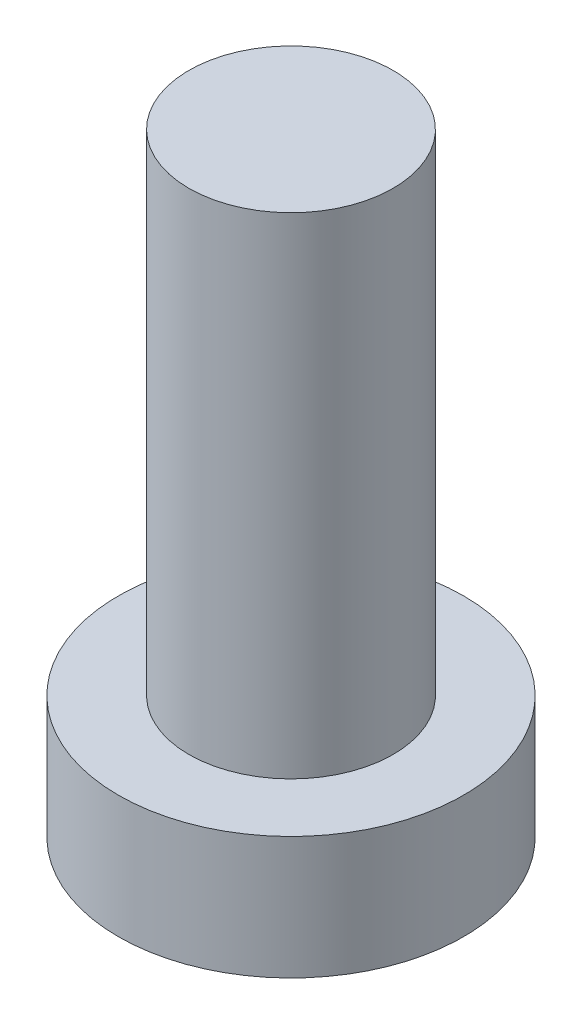
ISO-10303-21;
HEADER;
FILE_DESCRIPTION(('STEP AP214'),'2;1');
FILE_NAME('part.step','',(''),(''),'','','');
FILE_SCHEMA(('AUTOMOTIVE_DESIGN { 1 0 10303 214 1 1 1 1 }'));
ENDSEC;
DATA;
#1=APPLICATION_CONTEXT('core data for automotive mechanical design processes');
#2=APPLICATION_PROTOCOL_DEFINITION('international standard','automotive_design',2000,#1);
#3=PRODUCT_CONTEXT('',#1,'mechanical');
#4=PRODUCT('Part','Part','',(#3));
#5=PRODUCT_RELATED_PRODUCT_CATEGORY('part','',(#4));
#6=PRODUCT_DEFINITION_FORMATION('','',#4);
#7=PRODUCT_DEFINITION_CONTEXT('part definition',#1,'design');
#8=PRODUCT_DEFINITION('design','',#6,#7);
#9=PRODUCT_DEFINITION_SHAPE('','',#8);
#10=(LENGTH_UNIT() NAMED_UNIT(*) SI_UNIT(.MILLI.,.METRE.));
#11=(NAMED_UNIT(*) PLANE_ANGLE_UNIT() SI_UNIT($,.RADIAN.));
#12=(NAMED_UNIT(*) SI_UNIT($,.STERADIAN.) SOLID_ANGLE_UNIT());
#13=UNCERTAINTY_MEASURE_WITH_UNIT(LENGTH_MEASURE(1.E-05),#10,'distance_accuracy_value','');
#14=(GEOMETRIC_REPRESENTATION_CONTEXT(3) GLOBAL_UNCERTAINTY_ASSIGNED_CONTEXT((#13)) GLOBAL_UNIT_ASSIGNED_CONTEXT((#10,
#11,#12)) REPRESENTATION_CONTEXT('',''));
#15=CARTESIAN_POINT('',(0.,0.,0.));
#16=DIRECTION('',(0.,0.,1.));
#17=DIRECTION('',(1.,0.,0.));
#18=AXIS2_PLACEMENT_3D('',#15,#16,#17);
#19=CARTESIAN_POINT('',(0.,3.,0.));
#20=DIRECTION('',(0.,1.,0.));
#21=DIRECTION('',(0.,0.,1.));
#22=AXIS2_PLACEMENT_3D('',#19,#20,#21);
#23=PLANE('',#22);
#24=CARTESIAN_POINT('',(0.,3.,0.));
#25=DIRECTION('',(0.,1.,0.));
#26=DIRECTION('',(0.,0.,1.));
#27=AXIS2_PLACEMENT_3D('',#24,#25,#26);
#28=CIRCLE('',#27,4.225);
#29=CARTESIAN_POINT('',(0.,3.,4.225));
#30=VERTEX_POINT('',#29);
#31=EDGE_CURVE('E10',#30,#30,#28,.T.);
#32=ORIENTED_EDGE('',*,*,#31,.T.);
#33=EDGE_LOOP('',(#32));
#34=FACE_BOUND('',#33,.T.);
#35=CARTESIAN_POINT('',(0.,3.,0.));
#36=DIRECTION('',(0.,1.,0.));
#37=DIRECTION('',(0.,0.,1.));
#38=AXIS2_PLACEMENT_3D('',#35,#36,#37);
#39=CIRCLE('',#38,2.5);
#40=CARTESIAN_POINT('',(0.,3.,2.5));
#41=VERTEX_POINT('',#40);
#42=EDGE_CURVE('E52',#41,#41,#39,.T.);
#43=ORIENTED_EDGE('',*,*,#42,.F.);
#44=EDGE_LOOP('',(#43));
#45=FACE_BOUND('',#44,.T.);
#46=ADVANCED_FACE('F39',(#34,#45),#23,.T.);
#47=CARTESIAN_POINT('',(0.,0.,0.));
#48=DIRECTION('',(0.,1.,0.));
#49=DIRECTION('',(0.,0.,1.));
#50=AXIS2_PLACEMENT_3D('',#47,#48,#49);
#51=PLANE('',#50);
#52=CARTESIAN_POINT('',(0.,0.,0.));
#53=DIRECTION('',(0.,1.,0.));
#54=DIRECTION('',(0.,0.,1.));
#55=AXIS2_PLACEMENT_3D('',#52,#53,#54);
#56=CIRCLE('',#55,4.225);
#57=CARTESIAN_POINT('',(0.,0.,4.225));
#58=VERTEX_POINT('',#57);
#59=EDGE_CURVE('E43',#58,#58,#56,.T.);
#60=ORIENTED_EDGE('',*,*,#59,.F.);
#61=EDGE_LOOP('',(#60));
#62=FACE_BOUND('',#61,.T.);
#63=ADVANCED_FACE('F73',(#62),#51,.F.);
#64=CARTESIAN_POINT('',(0.,3.,0.));
#65=DIRECTION('',(0.,-1.,0.));
#66=DIRECTION('',(0.,0.,-1.));
#67=AXIS2_PLACEMENT_3D('',#64,#65,#66);
#68=CYLINDRICAL_SURFACE('',#67,4.225);
#69=ORIENTED_EDGE('',*,*,#31,.F.);
#70=EDGE_LOOP('',(#69));
#71=FACE_BOUND('',#70,.T.);
#72=ORIENTED_EDGE('',*,*,#59,.T.);
#73=EDGE_LOOP('',(#72));
#74=FACE_BOUND('',#73,.T.);
#75=ADVANCED_FACE('F41',(#71,#74),#68,.T.);
#76=CARTESIAN_POINT('',(0.,15.,0.));
#77=DIRECTION('',(0.,-1.,0.));
#78=DIRECTION('',(0.,0.,-1.));
#79=AXIS2_PLACEMENT_3D('',#76,#77,#78);
#80=CYLINDRICAL_SURFACE('',#79,2.5);
#81=ORIENTED_EDGE('',*,*,#42,.T.);
#82=EDGE_LOOP('',(#81));
#83=FACE_BOUND('',#82,.T.);
#84=CARTESIAN_POINT('',(0.,15.,0.));
#85=DIRECTION('',(0.,1.,0.));
#86=DIRECTION('',(0.,0.,1.));
#87=AXIS2_PLACEMENT_3D('',#84,#85,#86);
#88=CIRCLE('',#87,2.5);
#89=CARTESIAN_POINT('',(0.,15.,2.5));
#90=VERTEX_POINT('',#89);
#91=EDGE_CURVE('E57',#90,#90,#88,.T.);
#92=ORIENTED_EDGE('',*,*,#91,.F.);
#93=EDGE_LOOP('',(#92));
#94=FACE_BOUND('',#93,.T.);
#95=ADVANCED_FACE('F64',(#83,#94),#80,.T.);
#96=CARTESIAN_POINT('',(0.,15.,0.));
#97=DIRECTION('',(0.,1.,0.));
#98=DIRECTION('',(0.,0.,1.));
#99=AXIS2_PLACEMENT_3D('',#96,#97,#98);
#100=PLANE('',#99);
#101=ORIENTED_EDGE('',*,*,#91,.T.);
#102=EDGE_LOOP('',(#101));
#103=FACE_BOUND('',#102,.T.);
#104=ADVANCED_FACE('F62',(#103),#100,.T.);
#105=CLOSED_SHELL('',(#46,#63,#75,#95,#104));
#106=MANIFOLD_SOLID_BREP('B2',#105);
#107=ADVANCED_BREP_SHAPE_REPRESENTATION('',(#18,#106),#14);
#108=SHAPE_DEFINITION_REPRESENTATION(#9,#107);
ENDSEC;
END-ISO-10303-21;
